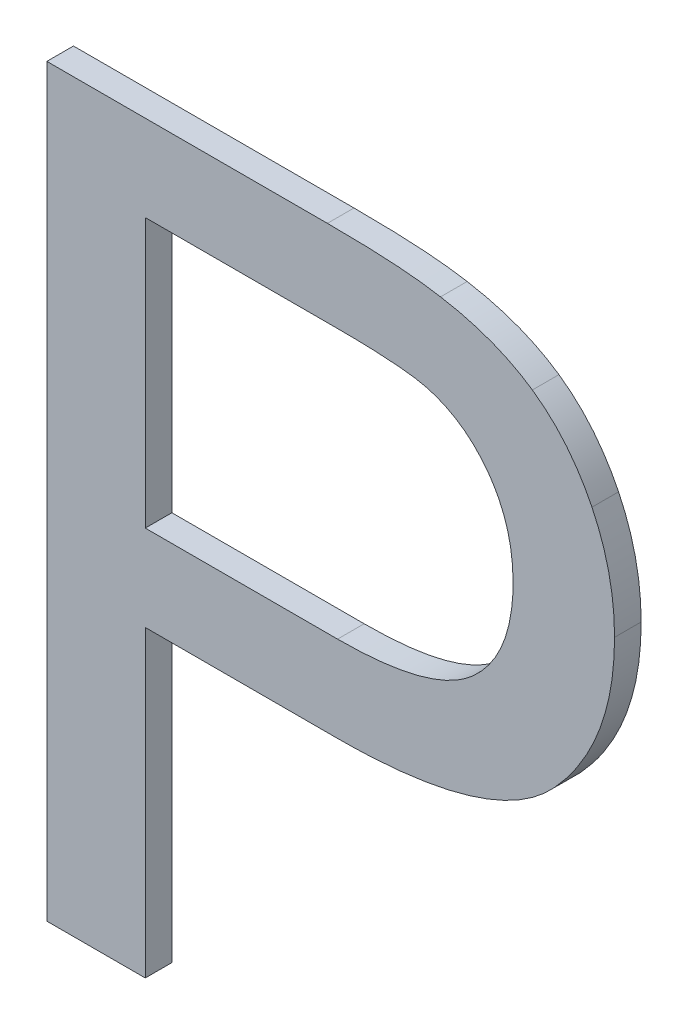
ISO-10303-21;
HEADER;
FILE_DESCRIPTION(('STEP AP214'),'2;1');
FILE_NAME('part.step','',(''),(''),'','','');
FILE_SCHEMA(('AUTOMOTIVE_DESIGN { 1 0 10303 214 1 1 1 1 }'));
ENDSEC;
DATA;
#1=APPLICATION_CONTEXT('core data for automotive mechanical design processes');
#2=APPLICATION_PROTOCOL_DEFINITION('international standard','automotive_design',2000,#1);
#3=PRODUCT_CONTEXT('',#1,'mechanical');
#4=PRODUCT('Part','Part','',(#3));
#5=PRODUCT_RELATED_PRODUCT_CATEGORY('part','',(#4));
#6=PRODUCT_DEFINITION_FORMATION('','',#4);
#7=PRODUCT_DEFINITION_CONTEXT('part definition',#1,'design');
#8=PRODUCT_DEFINITION('design','',#6,#7);
#9=PRODUCT_DEFINITION_SHAPE('','',#8);
#10=(LENGTH_UNIT() NAMED_UNIT(*) SI_UNIT(.MILLI.,.METRE.));
#11=(NAMED_UNIT(*) PLANE_ANGLE_UNIT() SI_UNIT($,.RADIAN.));
#12=(NAMED_UNIT(*) SI_UNIT($,.STERADIAN.) SOLID_ANGLE_UNIT());
#13=UNCERTAINTY_MEASURE_WITH_UNIT(LENGTH_MEASURE(1.E-05),#10,'distance_accuracy_value','');
#14=(GEOMETRIC_REPRESENTATION_CONTEXT(3) GLOBAL_UNCERTAINTY_ASSIGNED_CONTEXT((#13)) GLOBAL_UNIT_ASSIGNED_CONTEXT((#10,
#11,#12)) REPRESENTATION_CONTEXT('',''));
#15=CARTESIAN_POINT('',(0.,0.,0.));
#16=DIRECTION('',(0.,0.,1.));
#17=DIRECTION('',(1.,0.,0.));
#18=AXIS2_PLACEMENT_3D('',#15,#16,#17);
#19=CARTESIAN_POINT('',(3.01537266268,0.853362995687,0.05));
#20=DIRECTION('',(0.,0.,1.));
#21=DIRECTION('',(1.,0.,0.));
#22=AXIS2_PLACEMENT_3D('',#19,#20,#21);
#23=PLANE('',#22);
#24=DIRECTION('',(1.,0.,0.));
#25=VECTOR('',#24,1.);
#26=CARTESIAN_POINT('',(2.785882994186,0.732558139535,0.05));
#27=LINE('',#26,#25);
#28=CARTESIAN_POINT('',(2.785882994186,0.732558139535,0.05));
#29=VERTEX_POINT('',#28);
#30=CARTESIAN_POINT('',(3.147392805233,0.732558139535,0.05));
#31=VERTEX_POINT('',#30);
#32=EDGE_CURVE('E280',#29,#31,#27,.T.);
#33=ORIENTED_EDGE('',*,*,#32,.F.);
#34=DIRECTION('',(0.,-1.,0.));
#35=VECTOR('',#34,1.);
#36=CARTESIAN_POINT('',(2.785882994186,1.238226744186,0.05));
#37=LINE('',#36,#35);
#38=CARTESIAN_POINT('',(2.785882994186,1.238226744186,0.05));
#39=VERTEX_POINT('',#38);
#40=EDGE_CURVE('E393',#39,#29,#37,.T.);
#41=ORIENTED_EDGE('',*,*,#40,.F.);
#42=DIRECTION('',(-1.,0.,0.));
#43=VECTOR('',#42,1.);
#44=CARTESIAN_POINT('',(3.143577398256,1.238226744186,0.05));
#45=LINE('',#44,#43);
#46=CARTESIAN_POINT('',(3.143577398256,1.238226744186,0.05));
#47=VERTEX_POINT('',#46);
#48=EDGE_CURVE('E228',#47,#39,#45,.T.);
#49=ORIENTED_EDGE('',*,*,#48,.F.);
#50=CARTESIAN_POINT('',(3.316224563953,1.225699491279,0.05));
#51=CARTESIAN_POINT('',(3.269485828488,1.238226744186,0.05));
#52=CARTESIAN_POINT('',(3.143577398256,1.238226744186,0.05));
#53=(BOUNDED_CURVE() B_SPLINE_CURVE(2,(#50,#51,#52),.UNSPECIFIED.,.F.,
.F.) B_SPLINE_CURVE_WITH_KNOTS((3,3),(0.,1.),
.UNSPECIFIED.) CURVE() GEOMETRIC_REPRESENTATION_ITEM() RATIONAL_B_SPLINE_CURVE((1.,1.,1.)) REPRESENTATION_ITEM(''));
#54=CARTESIAN_POINT('',(3.316224563953,1.225699491279,0.05));
#55=VERTEX_POINT('',#54);
#56=EDGE_CURVE('E215',#55,#47,#53,.T.);
#57=ORIENTED_EDGE('',*,*,#56,.F.);
#58=CARTESIAN_POINT('',(3.433039607558,1.142205668605,0.05));
#59=CARTESIAN_POINT('',(3.388717296512,1.205414244186,0.05));
#60=CARTESIAN_POINT('',(3.316224563953,1.225699491279,0.05));
#61=(BOUNDED_CURVE() B_SPLINE_CURVE(2,(#58,#59,#60),.UNSPECIFIED.,.F.,
.F.) B_SPLINE_CURVE_WITH_KNOTS((3,3),(0.,1.),
.UNSPECIFIED.) CURVE() GEOMETRIC_REPRESENTATION_ITEM() RATIONAL_B_SPLINE_CURVE((1.,1.,1.)) REPRESENTATION_ITEM(''));
#62=CARTESIAN_POINT('',(3.433039607558,1.142205668605,0.05));
#63=VERTEX_POINT('',#62);
#64=EDGE_CURVE('E204',#63,#55,#61,.T.);
#65=ORIENTED_EDGE('',*,*,#64,.F.);
#66=CARTESIAN_POINT('',(3.477425508721,0.990225290698,0.05));
#67=CARTESIAN_POINT('',(3.477425508721,1.078997093023,0.05));
#68=CARTESIAN_POINT('',(3.433039607558,1.142205668605,0.05));
#69=(BOUNDED_CURVE() B_SPLINE_CURVE(2,(#66,#67,#68),.UNSPECIFIED.,.F.,
.F.) B_SPLINE_CURVE_WITH_KNOTS((3,3),(0.,1.),
.UNSPECIFIED.) CURVE() GEOMETRIC_REPRESENTATION_ITEM() RATIONAL_B_SPLINE_CURVE((1.,1.,1.)) REPRESENTATION_ITEM(''));
#70=CARTESIAN_POINT('',(3.477425508721,0.990225290698,0.05));
#71=VERTEX_POINT('',#70);
#72=EDGE_CURVE('E164',#71,#63,#69,.T.);
#73=ORIENTED_EDGE('',*,*,#72,.F.);
#74=CARTESIAN_POINT('',(3.40207122093,0.800090843023,0.05));
#75=CARTESIAN_POINT('',(3.477425508721,0.867687136628,0.05));
#76=CARTESIAN_POINT('',(3.477425508721,0.990225290698,0.05));
#77=(BOUNDED_CURVE() B_SPLINE_CURVE(2,(#74,#75,#76),.UNSPECIFIED.,.F.,
.F.) B_SPLINE_CURVE_WITH_KNOTS((3,3),(0.,1.),
.UNSPECIFIED.) CURVE() GEOMETRIC_REPRESENTATION_ITEM() RATIONAL_B_SPLINE_CURVE((1.,1.,1.)) REPRESENTATION_ITEM(''));
#78=CARTESIAN_POINT('',(3.40207122093,0.800090843023,0.05));
#79=VERTEX_POINT('',#78);
#80=EDGE_CURVE('E240',#79,#71,#77,.T.);
#81=ORIENTED_EDGE('',*,*,#80,.F.);
#82=CARTESIAN_POINT('',(3.147392805233,0.732558139535,0.05));
#83=CARTESIAN_POINT('',(3.32671693314,0.732558139535,0.05));
#84=CARTESIAN_POINT('',(3.40207122093,0.800090843023,0.05));
#85=(BOUNDED_CURVE() B_SPLINE_CURVE(2,(#82,#83,#84),.UNSPECIFIED.,.F.,
.F.) B_SPLINE_CURVE_WITH_KNOTS((3,3),(0.,1.),
.UNSPECIFIED.) CURVE() GEOMETRIC_REPRESENTATION_ITEM() RATIONAL_B_SPLINE_CURVE((1.,1.,1.)) REPRESENTATION_ITEM(''));
#86=EDGE_CURVE('E29',#31,#79,#85,.T.);
#87=ORIENTED_EDGE('',*,*,#86,.F.);
#88=EDGE_LOOP('',(#33,#41,#49,#57,#65,#73,#81,#87));
#89=FACE_BOUND('',#88,.T.);
#90=DIRECTION('',(0.,1.,0.));
#91=VECTOR('',#90,1.);
#92=CARTESIAN_POINT('',(2.600835755814,0.,0.05));
#93=LINE('',#92,#91);
#94=CARTESIAN_POINT('',(2.600835755814,0.,0.05));
#95=VERTEX_POINT('',#94);
#96=CARTESIAN_POINT('',(2.600835755814,1.4,0.05));
#97=VERTEX_POINT('',#96);
#98=EDGE_CURVE('E241',#95,#97,#93,.T.);
#99=ORIENTED_EDGE('',*,*,#98,.F.);
#100=DIRECTION('',(-1.,0.,0.));
#101=VECTOR('',#100,1.);
#102=CARTESIAN_POINT('',(2.785882994186,0.,0.05));
#103=LINE('',#102,#101);
#104=CARTESIAN_POINT('',(2.785882994186,0.,0.05));
#105=VERTEX_POINT('',#104);
#106=EDGE_CURVE('E271',#105,#95,#103,.T.);
#107=ORIENTED_EDGE('',*,*,#106,.F.);
#108=DIRECTION('',(0.,-1.,0.));
#109=VECTOR('',#108,1.);
#110=CARTESIAN_POINT('',(2.785882994186,0.570784883721,0.05));
#111=LINE('',#110,#109);
#112=CARTESIAN_POINT('',(2.785882994186,0.570784883721,0.05));
#113=VERTEX_POINT('',#112);
#114=EDGE_CURVE('E326',#113,#105,#111,.T.);
#115=ORIENTED_EDGE('',*,*,#114,.F.);
#116=DIRECTION('',(-1.,0.,0.));
#117=VECTOR('',#116,1.);
#118=CARTESIAN_POINT('',(3.14453125,0.570784883721,0.05));
#119=LINE('',#118,#117);
#120=CARTESIAN_POINT('',(3.14453125,0.570784883721,0.05));
#121=VERTEX_POINT('',#120);
#122=EDGE_CURVE('E254',#121,#113,#119,.T.);
#123=ORIENTED_EDGE('',*,*,#122,.F.);
#124=CARTESIAN_POINT('',(3.5546875,0.694213299419,0.05));
#125=CARTESIAN_POINT('',(3.441179142442,0.570784883721,0.05));
#126=CARTESIAN_POINT('',(3.14453125,0.570784883721,0.05));
#127=(BOUNDED_CURVE() B_SPLINE_CURVE(2,(#124,#125,#126),.UNSPECIFIED.,.F.,
.F.) B_SPLINE_CURVE_WITH_KNOTS((3,3),(0.,1.),
.UNSPECIFIED.) CURVE() GEOMETRIC_REPRESENTATION_ITEM() RATIONAL_B_SPLINE_CURVE((1.,1.,1.)) REPRESENTATION_ITEM(''));
#128=CARTESIAN_POINT('',(3.5546875,0.694213299419,0.05));
#129=VERTEX_POINT('',#128);
#130=EDGE_CURVE('E335',#129,#121,#127,.T.);
#131=ORIENTED_EDGE('',*,*,#130,.F.);
#132=CARTESIAN_POINT('',(3.668195857558,0.995884811047,0.05));
#133=CARTESIAN_POINT('',(3.668195857558,0.817641715116,0.05));
#134=CARTESIAN_POINT('',(3.5546875,0.694213299419,0.05));
#135=(BOUNDED_CURVE() B_SPLINE_CURVE(2,(#132,#133,#134),.UNSPECIFIED.,.F.,
.F.) B_SPLINE_CURVE_WITH_KNOTS((3,3),(0.,1.),
.UNSPECIFIED.) CURVE() GEOMETRIC_REPRESENTATION_ITEM() RATIONAL_B_SPLINE_CURVE((1.,1.,1.)) REPRESENTATION_ITEM(''));
#136=CARTESIAN_POINT('',(3.668195857558,0.995884811047,0.05));
#137=VERTEX_POINT('',#136);
#138=EDGE_CURVE('E287',#137,#129,#135,.T.);
#139=ORIENTED_EDGE('',*,*,#138,.F.);
#140=CARTESIAN_POINT('',(3.625717659884,1.186527979651,0.05));
#141=CARTESIAN_POINT('',(3.668195857558,1.099791061047,0.05));
#142=CARTESIAN_POINT('',(3.668195857558,0.995884811047,0.05));
#143=(BOUNDED_CURVE() B_SPLINE_CURVE(2,(#140,#141,#142),.UNSPECIFIED.,.F.,
.F.) B_SPLINE_CURVE_WITH_KNOTS((3,3),(0.,1.),
.UNSPECIFIED.) CURVE() GEOMETRIC_REPRESENTATION_ITEM() RATIONAL_B_SPLINE_CURVE((1.,1.,1.)) REPRESENTATION_ITEM(''));
#144=CARTESIAN_POINT('',(3.625717659884,1.186527979651,0.05));
#145=VERTEX_POINT('',#144);
#146=EDGE_CURVE('E269',#145,#137,#143,.T.);
#147=ORIENTED_EDGE('',*,*,#146,.F.);
#148=CARTESIAN_POINT('',(3.513671875,1.321339026163,0.05));
#149=CARTESIAN_POINT('',(3.583303052326,1.273264898256,0.05));
#150=CARTESIAN_POINT('',(3.625717659884,1.186527979651,0.05));
#151=(BOUNDED_CURVE() B_SPLINE_CURVE(2,(#148,#149,#150),.UNSPECIFIED.,.F.,
.F.) B_SPLINE_CURVE_WITH_KNOTS((3,3),(0.,1.),
.UNSPECIFIED.) CURVE() GEOMETRIC_REPRESENTATION_ITEM() RATIONAL_B_SPLINE_CURVE((1.,1.,1.)) REPRESENTATION_ITEM(''));
#152=CARTESIAN_POINT('',(3.513671875,1.321339026163,0.05));
#153=VERTEX_POINT('',#152);
#154=EDGE_CURVE('E300',#153,#145,#151,.T.);
#155=ORIENTED_EDGE('',*,*,#154,.F.);
#156=CARTESIAN_POINT('',(3.341024709302,1.386646075581,0.05));
#157=CARTESIAN_POINT('',(3.444040697674,1.369476744186,0.05));
#158=CARTESIAN_POINT('',(3.513671875,1.321339026163,0.05));
#159=(BOUNDED_CURVE() B_SPLINE_CURVE(2,(#156,#157,#158),.UNSPECIFIED.,.F.,
.F.) B_SPLINE_CURVE_WITH_KNOTS((3,3),(0.,1.),
.UNSPECIFIED.) CURVE() GEOMETRIC_REPRESENTATION_ITEM() RATIONAL_B_SPLINE_CURVE((1.,1.,1.)) REPRESENTATION_ITEM(''));
#160=CARTESIAN_POINT('',(3.341024709302,1.386646075581,0.05));
#161=VERTEX_POINT('',#160);
#162=EDGE_CURVE('E308',#161,#153,#159,.T.);
#163=ORIENTED_EDGE('',*,*,#162,.F.);
#164=CARTESIAN_POINT('',(3.128315770349,1.4,0.05));
#165=CARTESIAN_POINT('',(3.267578125,1.4,0.05));
#166=CARTESIAN_POINT('',(3.341024709302,1.386646075581,0.05));
#167=(BOUNDED_CURVE() B_SPLINE_CURVE(2,(#164,#165,#166),.UNSPECIFIED.,.F.,
.F.) B_SPLINE_CURVE_WITH_KNOTS((3,3),(0.,1.),
.UNSPECIFIED.) CURVE() GEOMETRIC_REPRESENTATION_ITEM() RATIONAL_B_SPLINE_CURVE((1.,1.,1.)) REPRESENTATION_ITEM(''));
#168=CARTESIAN_POINT('',(3.128315770349,1.4,0.05));
#169=VERTEX_POINT('',#168);
#170=EDGE_CURVE('E369',#169,#161,#167,.T.);
#171=ORIENTED_EDGE('',*,*,#170,.F.);
#172=DIRECTION('',(1.,0.,0.));
#173=VECTOR('',#172,1.);
#174=CARTESIAN_POINT('',(2.600835755814,1.4,0.05));
#175=LINE('',#174,#173);
#176=EDGE_CURVE('E233',#97,#169,#175,.T.);
#177=ORIENTED_EDGE('',*,*,#176,.F.);
#178=EDGE_LOOP('',(#99,#107,#115,#123,#131,#139,#147,#155,#163,#171,#177));
#179=FACE_BOUND('',#178,.T.);
#180=ADVANCED_FACE('F17',(#89,#179),#23,.T.);
#181=CARTESIAN_POINT('',(3.01537266268,0.853362995687,0.));
#182=DIRECTION('',(0.,0.,1.));
#183=DIRECTION('',(1.,0.,0.));
#184=AXIS2_PLACEMENT_3D('',#181,#182,#183);
#185=PLANE('',#184);
#186=CARTESIAN_POINT('',(3.147392805233,0.732558139535,0.));
#187=CARTESIAN_POINT('',(3.32671693314,0.732558139535,0.));
#188=CARTESIAN_POINT('',(3.40207122093,0.800090843023,0.));
#189=(BOUNDED_CURVE() B_SPLINE_CURVE(2,(#186,#187,#188),.UNSPECIFIED.,.F.,
.F.) B_SPLINE_CURVE_WITH_KNOTS((3,3),(0.,1.),
.UNSPECIFIED.) CURVE() GEOMETRIC_REPRESENTATION_ITEM() RATIONAL_B_SPLINE_CURVE((1.,1.,1.)) REPRESENTATION_ITEM(''));
#190=CARTESIAN_POINT('',(3.147392805233,0.732558139535,0.));
#191=VERTEX_POINT('',#190);
#192=CARTESIAN_POINT('',(3.40207122093,0.800090843023,0.));
#193=VERTEX_POINT('',#192);
#194=EDGE_CURVE('E11',#191,#193,#189,.T.);
#195=ORIENTED_EDGE('',*,*,#194,.T.);
#196=CARTESIAN_POINT('',(3.40207122093,0.800090843023,0.));
#197=CARTESIAN_POINT('',(3.477425508721,0.867687136628,0.));
#198=CARTESIAN_POINT('',(3.477425508721,0.990225290698,0.));
#199=(BOUNDED_CURVE() B_SPLINE_CURVE(2,(#196,#197,#198),.UNSPECIFIED.,.F.,
.F.) B_SPLINE_CURVE_WITH_KNOTS((3,3),(0.,1.),
.UNSPECIFIED.) CURVE() GEOMETRIC_REPRESENTATION_ITEM() RATIONAL_B_SPLINE_CURVE((1.,1.,1.)) REPRESENTATION_ITEM(''));
#200=CARTESIAN_POINT('',(3.477425508721,0.990225290698,0.));
#201=VERTEX_POINT('',#200);
#202=EDGE_CURVE('E261',#193,#201,#199,.T.);
#203=ORIENTED_EDGE('',*,*,#202,.T.);
#204=CARTESIAN_POINT('',(3.477425508721,0.990225290698,0.));
#205=CARTESIAN_POINT('',(3.477425508721,1.078997093023,0.));
#206=CARTESIAN_POINT('',(3.433039607558,1.142205668605,0.));
#207=(BOUNDED_CURVE() B_SPLINE_CURVE(2,(#204,#205,#206),.UNSPECIFIED.,.F.,
.F.) B_SPLINE_CURVE_WITH_KNOTS((3,3),(0.,1.),
.UNSPECIFIED.) CURVE() GEOMETRIC_REPRESENTATION_ITEM() RATIONAL_B_SPLINE_CURVE((1.,1.,1.)) REPRESENTATION_ITEM(''));
#208=CARTESIAN_POINT('',(3.433039607558,1.142205668605,0.));
#209=VERTEX_POINT('',#208);
#210=EDGE_CURVE('E175',#201,#209,#207,.T.);
#211=ORIENTED_EDGE('',*,*,#210,.T.);
#212=CARTESIAN_POINT('',(3.433039607558,1.142205668605,0.));
#213=CARTESIAN_POINT('',(3.388717296512,1.205414244186,0.));
#214=CARTESIAN_POINT('',(3.316224563953,1.225699491279,0.));
#215=(BOUNDED_CURVE() B_SPLINE_CURVE(2,(#212,#213,#214),.UNSPECIFIED.,.F.,
.F.) B_SPLINE_CURVE_WITH_KNOTS((3,3),(0.,1.),
.UNSPECIFIED.) CURVE() GEOMETRIC_REPRESENTATION_ITEM() RATIONAL_B_SPLINE_CURVE((1.,1.,1.)) REPRESENTATION_ITEM(''));
#216=CARTESIAN_POINT('',(3.316224563953,1.225699491279,0.));
#217=VERTEX_POINT('',#216);
#218=EDGE_CURVE('E193',#209,#217,#215,.T.);
#219=ORIENTED_EDGE('',*,*,#218,.T.);
#220=CARTESIAN_POINT('',(3.316224563953,1.225699491279,0.));
#221=CARTESIAN_POINT('',(3.269485828488,1.238226744186,0.));
#222=CARTESIAN_POINT('',(3.143577398256,1.238226744186,0.));
#223=(BOUNDED_CURVE() B_SPLINE_CURVE(2,(#220,#221,#222),.UNSPECIFIED.,.F.,
.F.) B_SPLINE_CURVE_WITH_KNOTS((3,3),(0.,1.),
.UNSPECIFIED.) CURVE() GEOMETRIC_REPRESENTATION_ITEM() RATIONAL_B_SPLINE_CURVE((1.,1.,1.)) REPRESENTATION_ITEM(''));
#224=CARTESIAN_POINT('',(3.143577398256,1.238226744186,0.));
#225=VERTEX_POINT('',#224);
#226=EDGE_CURVE('E197',#217,#225,#223,.T.);
#227=ORIENTED_EDGE('',*,*,#226,.T.);
#228=DIRECTION('',(-1.,0.,0.));
#229=VECTOR('',#228,1.);
#230=CARTESIAN_POINT('',(3.143577398256,1.238226744186,0.));
#231=LINE('',#230,#229);
#232=CARTESIAN_POINT('',(2.785882994186,1.238226744186,0.));
#233=VERTEX_POINT('',#232);
#234=EDGE_CURVE('E220',#225,#233,#231,.T.);
#235=ORIENTED_EDGE('',*,*,#234,.T.);
#236=DIRECTION('',(0.,-1.,0.));
#237=VECTOR('',#236,1.);
#238=CARTESIAN_POINT('',(2.785882994186,1.238226744186,0.));
#239=LINE('',#238,#237);
#240=CARTESIAN_POINT('',(2.785882994186,0.732558139535,0.));
#241=VERTEX_POINT('',#240);
#242=EDGE_CURVE('E353',#233,#241,#239,.T.);
#243=ORIENTED_EDGE('',*,*,#242,.T.);
#244=DIRECTION('',(1.,0.,0.));
#245=VECTOR('',#244,1.);
#246=CARTESIAN_POINT('',(2.785882994186,0.732558139535,0.));
#247=LINE('',#246,#245);
#248=EDGE_CURVE('E279',#241,#191,#247,.T.);
#249=ORIENTED_EDGE('',*,*,#248,.T.);
#250=EDGE_LOOP('',(#195,#203,#211,#219,#227,#235,#243,#249));
#251=FACE_BOUND('',#250,.T.);
#252=DIRECTION('',(1.,0.,0.));
#253=VECTOR('',#252,1.);
#254=CARTESIAN_POINT('',(2.600835755814,1.4,0.));
#255=LINE('',#254,#253);
#256=CARTESIAN_POINT('',(2.600835755814,1.4,0.));
#257=VERTEX_POINT('',#256);
#258=CARTESIAN_POINT('',(3.128315770349,1.4,0.));
#259=VERTEX_POINT('',#258);
#260=EDGE_CURVE('E22',#257,#259,#255,.T.);
#261=ORIENTED_EDGE('',*,*,#260,.T.);
#262=CARTESIAN_POINT('',(3.128315770349,1.4,0.));
#263=CARTESIAN_POINT('',(3.267578125,1.4,0.));
#264=CARTESIAN_POINT('',(3.341024709302,1.386646075581,0.));
#265=(BOUNDED_CURVE() B_SPLINE_CURVE(2,(#262,#263,#264),.UNSPECIFIED.,.F.,
.F.) B_SPLINE_CURVE_WITH_KNOTS((3,3),(0.,1.),
.UNSPECIFIED.) CURVE() GEOMETRIC_REPRESENTATION_ITEM() RATIONAL_B_SPLINE_CURVE((1.,1.,1.)) REPRESENTATION_ITEM(''));
#266=CARTESIAN_POINT('',(3.341024709302,1.386646075581,0.));
#267=VERTEX_POINT('',#266);
#268=EDGE_CURVE('E235',#259,#267,#265,.T.);
#269=ORIENTED_EDGE('',*,*,#268,.T.);
#270=CARTESIAN_POINT('',(3.341024709302,1.386646075581,0.));
#271=CARTESIAN_POINT('',(3.444040697674,1.369476744186,0.));
#272=CARTESIAN_POINT('',(3.513671875,1.321339026163,0.));
#273=(BOUNDED_CURVE() B_SPLINE_CURVE(2,(#270,#271,#272),.UNSPECIFIED.,.F.,
.F.) B_SPLINE_CURVE_WITH_KNOTS((3,3),(0.,1.),
.UNSPECIFIED.) CURVE() GEOMETRIC_REPRESENTATION_ITEM() RATIONAL_B_SPLINE_CURVE((1.,1.,1.)) REPRESENTATION_ITEM(''));
#274=CARTESIAN_POINT('',(3.513671875,1.321339026163,0.));
#275=VERTEX_POINT('',#274);
#276=EDGE_CURVE('E302',#267,#275,#273,.T.);
#277=ORIENTED_EDGE('',*,*,#276,.T.);
#278=CARTESIAN_POINT('',(3.513671875,1.321339026163,0.));
#279=CARTESIAN_POINT('',(3.583303052326,1.273264898256,0.));
#280=CARTESIAN_POINT('',(3.625717659884,1.186527979651,0.));
#281=(BOUNDED_CURVE() B_SPLINE_CURVE(2,(#278,#279,#280),.UNSPECIFIED.,.F.,
.F.) B_SPLINE_CURVE_WITH_KNOTS((3,3),(0.,1.),
.UNSPECIFIED.) CURVE() GEOMETRIC_REPRESENTATION_ITEM() RATIONAL_B_SPLINE_CURVE((1.,1.,1.)) REPRESENTATION_ITEM(''));
#282=CARTESIAN_POINT('',(3.625717659884,1.186527979651,0.));
#283=VERTEX_POINT('',#282);
#284=EDGE_CURVE('E329',#275,#283,#281,.T.);
#285=ORIENTED_EDGE('',*,*,#284,.T.);
#286=CARTESIAN_POINT('',(3.625717659884,1.186527979651,0.));
#287=CARTESIAN_POINT('',(3.668195857558,1.099791061047,0.));
#288=CARTESIAN_POINT('',(3.668195857558,0.995884811047,0.));
#289=(BOUNDED_CURVE() B_SPLINE_CURVE(2,(#286,#287,#288),.UNSPECIFIED.,.F.,
.F.) B_SPLINE_CURVE_WITH_KNOTS((3,3),(0.,1.),
.UNSPECIFIED.) CURVE() GEOMETRIC_REPRESENTATION_ITEM() RATIONAL_B_SPLINE_CURVE((1.,1.,1.)) REPRESENTATION_ITEM(''));
#290=CARTESIAN_POINT('',(3.668195857558,0.995884811047,0.));
#291=VERTEX_POINT('',#290);
#292=EDGE_CURVE('E301',#283,#291,#289,.T.);
#293=ORIENTED_EDGE('',*,*,#292,.T.);
#294=CARTESIAN_POINT('',(3.668195857558,0.995884811047,0.));
#295=CARTESIAN_POINT('',(3.668195857558,0.817641715116,0.));
#296=CARTESIAN_POINT('',(3.5546875,0.694213299419,0.));
#297=(BOUNDED_CURVE() B_SPLINE_CURVE(2,(#294,#295,#296),.UNSPECIFIED.,.F.,
.F.) B_SPLINE_CURVE_WITH_KNOTS((3,3),(0.,1.),
.UNSPECIFIED.) CURVE() GEOMETRIC_REPRESENTATION_ITEM() RATIONAL_B_SPLINE_CURVE((1.,1.,1.)) REPRESENTATION_ITEM(''));
#298=CARTESIAN_POINT('',(3.5546875,0.694213299419,0.));
#299=VERTEX_POINT('',#298);
#300=EDGE_CURVE('E270',#291,#299,#297,.T.);
#301=ORIENTED_EDGE('',*,*,#300,.T.);
#302=CARTESIAN_POINT('',(3.5546875,0.694213299419,0.));
#303=CARTESIAN_POINT('',(3.441179142442,0.570784883721,0.));
#304=CARTESIAN_POINT('',(3.14453125,0.570784883721,0.));
#305=(BOUNDED_CURVE() B_SPLINE_CURVE(2,(#302,#303,#304),.UNSPECIFIED.,.F.,
.F.) B_SPLINE_CURVE_WITH_KNOTS((3,3),(0.,1.),
.UNSPECIFIED.) CURVE() GEOMETRIC_REPRESENTATION_ITEM() RATIONAL_B_SPLINE_CURVE((1.,1.,1.)) REPRESENTATION_ITEM(''));
#306=CARTESIAN_POINT('',(3.14453125,0.570784883721,0.));
#307=VERTEX_POINT('',#306);
#308=EDGE_CURVE('E343',#299,#307,#305,.T.);
#309=ORIENTED_EDGE('',*,*,#308,.T.);
#310=DIRECTION('',(-1.,0.,0.));
#311=VECTOR('',#310,1.);
#312=CARTESIAN_POINT('',(3.14453125,0.570784883721,0.));
#313=LINE('',#312,#311);
#314=CARTESIAN_POINT('',(2.785882994186,0.570784883721,0.));
#315=VERTEX_POINT('',#314);
#316=EDGE_CURVE('E286',#307,#315,#313,.T.);
#317=ORIENTED_EDGE('',*,*,#316,.T.);
#318=DIRECTION('',(0.,-1.,0.));
#319=VECTOR('',#318,1.);
#320=CARTESIAN_POINT('',(2.785882994186,0.570784883721,0.));
#321=LINE('',#320,#319);
#322=CARTESIAN_POINT('',(2.785882994186,0.,0.));
#323=VERTEX_POINT('',#322);
#324=EDGE_CURVE('E255',#315,#323,#321,.T.);
#325=ORIENTED_EDGE('',*,*,#324,.T.);
#326=DIRECTION('',(-1.,0.,0.));
#327=VECTOR('',#326,1.);
#328=CARTESIAN_POINT('',(2.785882994186,0.,0.));
#329=LINE('',#328,#327);
#330=CARTESIAN_POINT('',(2.600835755814,0.,0.));
#331=VERTEX_POINT('',#330);
#332=EDGE_CURVE('E274',#323,#331,#329,.T.);
#333=ORIENTED_EDGE('',*,*,#332,.T.);
#334=DIRECTION('',(0.,1.,0.));
#335=VECTOR('',#334,1.);
#336=CARTESIAN_POINT('',(2.600835755814,0.,0.));
#337=LINE('',#336,#335);
#338=EDGE_CURVE('E411',#331,#257,#337,.T.);
#339=ORIENTED_EDGE('',*,*,#338,.T.);
#340=EDGE_LOOP('',(#261,#269,#277,#285,#293,#301,#309,#317,#325,#333,#339));
#341=FACE_BOUND('',#340,.T.);
#342=ADVANCED_FACE('F195',(#251,#341),#185,.F.);
#343=CARTESIAN_POINT('',(3.147392805233,0.732558139535,0.));
#344=CARTESIAN_POINT('',(3.32671693314,0.732558139535,0.));
#345=CARTESIAN_POINT('',(3.40207122093,0.800090843023,0.));
#346=(BOUNDED_CURVE() B_SPLINE_CURVE(2,(#343,#344,#345),.UNSPECIFIED.,.F.,
.F.) B_SPLINE_CURVE_WITH_KNOTS((3,3),(0.,1.),
.UNSPECIFIED.) CURVE() GEOMETRIC_REPRESENTATION_ITEM() RATIONAL_B_SPLINE_CURVE((1.,1.,1.)) REPRESENTATION_ITEM(''));
#347=DIRECTION('',(0.,0.,-1.));
#348=VECTOR('',#347,1.);
#349=SURFACE_OF_LINEAR_EXTRUSION('',#346,#348);
#350=DIRECTION('',(0.,0.,1.));
#351=VECTOR('',#350,1.);
#352=CARTESIAN_POINT('',(3.147392805233,0.732558139535,0.));
#353=LINE('',#352,#351);
#354=EDGE_CURVE('E276',#191,#31,#353,.T.);
#355=ORIENTED_EDGE('',*,*,#354,.T.);
#356=ORIENTED_EDGE('',*,*,#86,.T.);
#357=DIRECTION('',(0.,0.,1.));
#358=VECTOR('',#357,1.);
#359=CARTESIAN_POINT('',(3.40207122093,0.800090843023,0.));
#360=LINE('',#359,#358);
#361=EDGE_CURVE('E236',#193,#79,#360,.T.);
#362=ORIENTED_EDGE('',*,*,#361,.F.);
#363=ORIENTED_EDGE('',*,*,#194,.F.);
#364=EDGE_LOOP('',(#355,#356,#362,#363));
#365=FACE_BOUND('',#364,.T.);
#366=ADVANCED_FACE('F593',(#365),#349,.T.);
#367=CARTESIAN_POINT('',(3.40207122093,0.800090843023,0.));
#368=CARTESIAN_POINT('',(3.477425508721,0.867687136628,0.));
#369=CARTESIAN_POINT('',(3.477425508721,0.990225290698,0.));
#370=(BOUNDED_CURVE() B_SPLINE_CURVE(2,(#367,#368,#369),.UNSPECIFIED.,.F.,
.F.) B_SPLINE_CURVE_WITH_KNOTS((3,3),(0.,1.),
.UNSPECIFIED.) CURVE() GEOMETRIC_REPRESENTATION_ITEM() RATIONAL_B_SPLINE_CURVE((1.,1.,1.)) REPRESENTATION_ITEM(''));
#371=DIRECTION('',(0.,0.,-1.));
#372=VECTOR('',#371,1.);
#373=SURFACE_OF_LINEAR_EXTRUSION('',#370,#372);
#374=ORIENTED_EDGE('',*,*,#361,.T.);
#375=ORIENTED_EDGE('',*,*,#80,.T.);
#376=DIRECTION('',(0.,0.,1.));
#377=VECTOR('',#376,1.);
#378=CARTESIAN_POINT('',(3.477425508721,0.990225290698,0.));
#379=LINE('',#378,#377);
#380=EDGE_CURVE('E203',#201,#71,#379,.T.);
#381=ORIENTED_EDGE('',*,*,#380,.F.);
#382=ORIENTED_EDGE('',*,*,#202,.F.);
#383=EDGE_LOOP('',(#374,#375,#381,#382));
#384=FACE_BOUND('',#383,.T.);
#385=ADVANCED_FACE('F19',(#384),#373,.T.);
#386=CARTESIAN_POINT('',(3.477425508721,0.990225290698,0.));
#387=CARTESIAN_POINT('',(3.477425508721,1.078997093023,0.));
#388=CARTESIAN_POINT('',(3.433039607558,1.142205668605,0.));
#389=(BOUNDED_CURVE() B_SPLINE_CURVE(2,(#386,#387,#388),.UNSPECIFIED.,.F.,
.F.) B_SPLINE_CURVE_WITH_KNOTS((3,3),(0.,1.),
.UNSPECIFIED.) CURVE() GEOMETRIC_REPRESENTATION_ITEM() RATIONAL_B_SPLINE_CURVE((1.,1.,1.)) REPRESENTATION_ITEM(''));
#390=DIRECTION('',(0.,0.,-1.));
#391=VECTOR('',#390,1.);
#392=SURFACE_OF_LINEAR_EXTRUSION('',#389,#391);
#393=ORIENTED_EDGE('',*,*,#380,.T.);
#394=ORIENTED_EDGE('',*,*,#72,.T.);
#395=DIRECTION('',(0.,0.,1.));
#396=VECTOR('',#395,1.);
#397=CARTESIAN_POINT('',(3.433039607558,1.142205668605,0.));
#398=LINE('',#397,#396);
#399=EDGE_CURVE('E214',#209,#63,#398,.T.);
#400=ORIENTED_EDGE('',*,*,#399,.F.);
#401=ORIENTED_EDGE('',*,*,#210,.F.);
#402=EDGE_LOOP('',(#393,#394,#400,#401));
#403=FACE_BOUND('',#402,.T.);
#404=ADVANCED_FACE('F606',(#403),#392,.T.);
#405=CARTESIAN_POINT('',(3.433039607558,1.142205668605,0.));
#406=CARTESIAN_POINT('',(3.388717296512,1.205414244186,0.));
#407=CARTESIAN_POINT('',(3.316224563953,1.225699491279,0.));
#408=(BOUNDED_CURVE() B_SPLINE_CURVE(2,(#405,#406,#407),.UNSPECIFIED.,.F.,
.F.) B_SPLINE_CURVE_WITH_KNOTS((3,3),(0.,1.),
.UNSPECIFIED.) CURVE() GEOMETRIC_REPRESENTATION_ITEM() RATIONAL_B_SPLINE_CURVE((1.,1.,1.)) REPRESENTATION_ITEM(''));
#409=DIRECTION('',(0.,0.,-1.));
#410=VECTOR('',#409,1.);
#411=SURFACE_OF_LINEAR_EXTRUSION('',#408,#410);
#412=ORIENTED_EDGE('',*,*,#399,.T.);
#413=ORIENTED_EDGE('',*,*,#64,.T.);
#414=DIRECTION('',(0.,0.,1.));
#415=VECTOR('',#414,1.);
#416=CARTESIAN_POINT('',(3.316224563953,1.225699491279,0.));
#417=LINE('',#416,#415);
#418=EDGE_CURVE('E210',#217,#55,#417,.T.);
#419=ORIENTED_EDGE('',*,*,#418,.F.);
#420=ORIENTED_EDGE('',*,*,#218,.F.);
#421=EDGE_LOOP('',(#412,#413,#419,#420));
#422=FACE_BOUND('',#421,.T.);
#423=ADVANCED_FACE('F217',(#422),#411,.T.);
#424=CARTESIAN_POINT('',(3.316224563953,1.225699491279,0.));
#425=CARTESIAN_POINT('',(3.269485828488,1.238226744186,0.));
#426=CARTESIAN_POINT('',(3.143577398256,1.238226744186,0.));
#427=(BOUNDED_CURVE() B_SPLINE_CURVE(2,(#424,#425,#426),.UNSPECIFIED.,.F.,
.F.) B_SPLINE_CURVE_WITH_KNOTS((3,3),(0.,1.),
.UNSPECIFIED.) CURVE() GEOMETRIC_REPRESENTATION_ITEM() RATIONAL_B_SPLINE_CURVE((1.,1.,1.)) REPRESENTATION_ITEM(''));
#428=DIRECTION('',(0.,0.,-1.));
#429=VECTOR('',#428,1.);
#430=SURFACE_OF_LINEAR_EXTRUSION('',#427,#429);
#431=ORIENTED_EDGE('',*,*,#418,.T.);
#432=ORIENTED_EDGE('',*,*,#56,.T.);
#433=DIRECTION('',(0.,0.,1.));
#434=VECTOR('',#433,1.);
#435=CARTESIAN_POINT('',(3.143577398256,1.238226744186,0.));
#436=LINE('',#435,#434);
#437=EDGE_CURVE('E212',#225,#47,#436,.T.);
#438=ORIENTED_EDGE('',*,*,#437,.F.);
#439=ORIENTED_EDGE('',*,*,#226,.F.);
#440=EDGE_LOOP('',(#431,#432,#438,#439));
#441=FACE_BOUND('',#440,.T.);
#442=ADVANCED_FACE('F209',(#441),#430,.T.);
#443=CARTESIAN_POINT('',(3.143577398256,1.238226744186,0.));
#444=DIRECTION('',(0.,-1.,0.));
#445=DIRECTION('',(0.,0.,-1.));
#446=AXIS2_PLACEMENT_3D('',#443,#444,#445);
#447=PLANE('',#446);
#448=ORIENTED_EDGE('',*,*,#437,.T.);
#449=ORIENTED_EDGE('',*,*,#48,.T.);
#450=DIRECTION('',(0.,0.,1.));
#451=VECTOR('',#450,1.);
#452=CARTESIAN_POINT('',(2.785882994186,1.238226744186,0.));
#453=LINE('',#452,#451);
#454=EDGE_CURVE('E231',#233,#39,#453,.T.);
#455=ORIENTED_EDGE('',*,*,#454,.F.);
#456=ORIENTED_EDGE('',*,*,#234,.F.);
#457=EDGE_LOOP('',(#448,#449,#455,#456));
#458=FACE_BOUND('',#457,.T.);
#459=ADVANCED_FACE('F566',(#458),#447,.T.);
#460=CARTESIAN_POINT('',(2.785882994186,1.238226744186,0.));
#461=DIRECTION('',(1.,0.,0.));
#462=DIRECTION('',(0.,1.,0.));
#463=AXIS2_PLACEMENT_3D('',#460,#461,#462);
#464=PLANE('',#463);
#465=ORIENTED_EDGE('',*,*,#454,.T.);
#466=ORIENTED_EDGE('',*,*,#40,.T.);
#467=DIRECTION('',(0.,0.,1.));
#468=VECTOR('',#467,1.);
#469=CARTESIAN_POINT('',(2.785882994186,0.732558139535,0.));
#470=LINE('',#469,#468);
#471=EDGE_CURVE('E309',#241,#29,#470,.T.);
#472=ORIENTED_EDGE('',*,*,#471,.F.);
#473=ORIENTED_EDGE('',*,*,#242,.F.);
#474=EDGE_LOOP('',(#465,#466,#472,#473));
#475=FACE_BOUND('',#474,.T.);
#476=ADVANCED_FACE('F562',(#475),#464,.T.);
#477=CARTESIAN_POINT('',(2.785882994186,0.732558139535,0.));
#478=DIRECTION('',(0.,1.,0.));
#479=DIRECTION('',(1.,0.,0.));
#480=AXIS2_PLACEMENT_3D('',#477,#478,#479);
#481=PLANE('',#480);
#482=ORIENTED_EDGE('',*,*,#471,.T.);
#483=ORIENTED_EDGE('',*,*,#32,.T.);
#484=ORIENTED_EDGE('',*,*,#354,.F.);
#485=ORIENTED_EDGE('',*,*,#248,.F.);
#486=EDGE_LOOP('',(#482,#483,#484,#485));
#487=FACE_BOUND('',#486,.T.);
#488=ADVANCED_FACE('F565',(#487),#481,.T.);
#489=CARTESIAN_POINT('',(2.600835755814,1.4,0.));
#490=DIRECTION('',(0.,1.,0.));
#491=DIRECTION('',(1.,0.,0.));
#492=AXIS2_PLACEMENT_3D('',#489,#490,#491);
#493=PLANE('',#492);
#494=DIRECTION('',(0.,0.,1.));
#495=VECTOR('',#494,1.);
#496=CARTESIAN_POINT('',(2.600835755814,1.4,0.));
#497=LINE('',#496,#495);
#498=EDGE_CURVE('E245',#257,#97,#497,.T.);
#499=ORIENTED_EDGE('',*,*,#498,.T.);
#500=ORIENTED_EDGE('',*,*,#176,.T.);
#501=DIRECTION('',(0.,0.,1.));
#502=VECTOR('',#501,1.);
#503=CARTESIAN_POINT('',(3.128315770349,1.4,0.));
#504=LINE('',#503,#502);
#505=EDGE_CURVE('E307',#259,#169,#504,.T.);
#506=ORIENTED_EDGE('',*,*,#505,.F.);
#507=ORIENTED_EDGE('',*,*,#260,.F.);
#508=EDGE_LOOP('',(#499,#500,#506,#507));
#509=FACE_BOUND('',#508,.T.);
#510=ADVANCED_FACE('F696',(#509),#493,.T.);
#511=CARTESIAN_POINT('',(3.128315770349,1.4,0.));
#512=CARTESIAN_POINT('',(3.267578125,1.4,0.));
#513=CARTESIAN_POINT('',(3.341024709302,1.386646075581,0.));
#514=(BOUNDED_CURVE() B_SPLINE_CURVE(2,(#511,#512,#513),.UNSPECIFIED.,.F.,
.F.) B_SPLINE_CURVE_WITH_KNOTS((3,3),(0.,1.),
.UNSPECIFIED.) CURVE() GEOMETRIC_REPRESENTATION_ITEM() RATIONAL_B_SPLINE_CURVE((1.,1.,1.)) REPRESENTATION_ITEM(''));
#515=DIRECTION('',(0.,0.,-1.));
#516=VECTOR('',#515,1.);
#517=SURFACE_OF_LINEAR_EXTRUSION('',#514,#516);
#518=ORIENTED_EDGE('',*,*,#505,.T.);
#519=ORIENTED_EDGE('',*,*,#170,.T.);
#520=DIRECTION('',(0.,0.,1.));
#521=VECTOR('',#520,1.);
#522=CARTESIAN_POINT('',(3.341024709302,1.386646075581,0.));
#523=LINE('',#522,#521);
#524=EDGE_CURVE('E334',#267,#161,#523,.T.);
#525=ORIENTED_EDGE('',*,*,#524,.F.);
#526=ORIENTED_EDGE('',*,*,#268,.F.);
#527=EDGE_LOOP('',(#518,#519,#525,#526));
#528=FACE_BOUND('',#527,.T.);
#529=ADVANCED_FACE('F554',(#528),#517,.T.);
#530=CARTESIAN_POINT('',(3.341024709302,1.386646075581,0.));
#531=CARTESIAN_POINT('',(3.444040697674,1.369476744186,0.));
#532=CARTESIAN_POINT('',(3.513671875,1.321339026163,0.));
#533=(BOUNDED_CURVE() B_SPLINE_CURVE(2,(#530,#531,#532),.UNSPECIFIED.,.F.,
.F.) B_SPLINE_CURVE_WITH_KNOTS((3,3),(0.,1.),
.UNSPECIFIED.) CURVE() GEOMETRIC_REPRESENTATION_ITEM() RATIONAL_B_SPLINE_CURVE((1.,1.,1.)) REPRESENTATION_ITEM(''));
#534=DIRECTION('',(0.,0.,-1.));
#535=VECTOR('',#534,1.);
#536=SURFACE_OF_LINEAR_EXTRUSION('',#533,#535);
#537=ORIENTED_EDGE('',*,*,#524,.T.);
#538=ORIENTED_EDGE('',*,*,#162,.T.);
#539=DIRECTION('',(0.,0.,1.));
#540=VECTOR('',#539,1.);
#541=CARTESIAN_POINT('',(3.513671875,1.321339026163,0.));
#542=LINE('',#541,#540);
#543=EDGE_CURVE('E293',#275,#153,#542,.T.);
#544=ORIENTED_EDGE('',*,*,#543,.F.);
#545=ORIENTED_EDGE('',*,*,#276,.F.);
#546=EDGE_LOOP('',(#537,#538,#544,#545));
#547=FACE_BOUND('',#546,.T.);
#548=ADVANCED_FACE('F550',(#547),#536,.T.);
#549=CARTESIAN_POINT('',(3.513671875,1.321339026163,0.));
#550=CARTESIAN_POINT('',(3.583303052326,1.273264898256,0.));
#551=CARTESIAN_POINT('',(3.625717659884,1.186527979651,0.));
#552=(BOUNDED_CURVE() B_SPLINE_CURVE(2,(#549,#550,#551),.UNSPECIFIED.,.F.,
.F.) B_SPLINE_CURVE_WITH_KNOTS((3,3),(0.,1.),
.UNSPECIFIED.) CURVE() GEOMETRIC_REPRESENTATION_ITEM() RATIONAL_B_SPLINE_CURVE((1.,1.,1.)) REPRESENTATION_ITEM(''));
#553=DIRECTION('',(0.,0.,-1.));
#554=VECTOR('',#553,1.);
#555=SURFACE_OF_LINEAR_EXTRUSION('',#552,#554);
#556=ORIENTED_EDGE('',*,*,#543,.T.);
#557=ORIENTED_EDGE('',*,*,#154,.T.);
#558=DIRECTION('',(0.,0.,1.));
#559=VECTOR('',#558,1.);
#560=CARTESIAN_POINT('',(3.625717659884,1.186527979651,0.));
#561=LINE('',#560,#559);
#562=EDGE_CURVE('E262',#283,#145,#561,.T.);
#563=ORIENTED_EDGE('',*,*,#562,.F.);
#564=ORIENTED_EDGE('',*,*,#284,.F.);
#565=EDGE_LOOP('',(#556,#557,#563,#564));
#566=FACE_BOUND('',#565,.T.);
#567=ADVANCED_FACE('F553',(#566),#555,.T.);
#568=CARTESIAN_POINT('',(3.625717659884,1.186527979651,0.));
#569=CARTESIAN_POINT('',(3.668195857558,1.099791061047,0.));
#570=CARTESIAN_POINT('',(3.668195857558,0.995884811047,0.));
#571=(BOUNDED_CURVE() B_SPLINE_CURVE(2,(#568,#569,#570),.UNSPECIFIED.,.F.,
.F.) B_SPLINE_CURVE_WITH_KNOTS((3,3),(0.,1.),
.UNSPECIFIED.) CURVE() GEOMETRIC_REPRESENTATION_ITEM() RATIONAL_B_SPLINE_CURVE((1.,1.,1.)) REPRESENTATION_ITEM(''));
#572=DIRECTION('',(0.,0.,-1.));
#573=VECTOR('',#572,1.);
#574=SURFACE_OF_LINEAR_EXTRUSION('',#571,#573);
#575=ORIENTED_EDGE('',*,*,#562,.T.);
#576=ORIENTED_EDGE('',*,*,#146,.T.);
#577=DIRECTION('',(0.,0.,1.));
#578=VECTOR('',#577,1.);
#579=CARTESIAN_POINT('',(3.668195857558,0.995884811047,0.));
#580=LINE('',#579,#578);
#581=EDGE_CURVE('E292',#291,#137,#580,.T.);
#582=ORIENTED_EDGE('',*,*,#581,.F.);
#583=ORIENTED_EDGE('',*,*,#292,.F.);
#584=EDGE_LOOP('',(#575,#576,#582,#583));
#585=FACE_BOUND('',#584,.T.);
#586=ADVANCED_FACE('F569',(#585),#574,.T.);
#587=CARTESIAN_POINT('',(3.668195857558,0.995884811047,0.));
#588=CARTESIAN_POINT('',(3.668195857558,0.817641715116,0.));
#589=CARTESIAN_POINT('',(3.5546875,0.694213299419,0.));
#590=(BOUNDED_CURVE() B_SPLINE_CURVE(2,(#587,#588,#589),.UNSPECIFIED.,.F.,
.F.) B_SPLINE_CURVE_WITH_KNOTS((3,3),(0.,1.),
.UNSPECIFIED.) CURVE() GEOMETRIC_REPRESENTATION_ITEM() RATIONAL_B_SPLINE_CURVE((1.,1.,1.)) REPRESENTATION_ITEM(''));
#591=DIRECTION('',(0.,0.,-1.));
#592=VECTOR('',#591,1.);
#593=SURFACE_OF_LINEAR_EXTRUSION('',#590,#592);
#594=ORIENTED_EDGE('',*,*,#581,.T.);
#595=ORIENTED_EDGE('',*,*,#138,.T.);
#596=DIRECTION('',(0.,0.,1.));
#597=VECTOR('',#596,1.);
#598=CARTESIAN_POINT('',(3.5546875,0.694213299419,0.));
#599=LINE('',#598,#597);
#600=EDGE_CURVE('E344',#299,#129,#599,.T.);
#601=ORIENTED_EDGE('',*,*,#600,.F.);
#602=ORIENTED_EDGE('',*,*,#300,.F.);
#603=EDGE_LOOP('',(#594,#595,#601,#602));
#604=FACE_BOUND('',#603,.T.);
#605=ADVANCED_FACE('F560',(#604),#593,.T.);
#606=CARTESIAN_POINT('',(3.5546875,0.694213299419,0.));
#607=CARTESIAN_POINT('',(3.441179142442,0.570784883721,0.));
#608=CARTESIAN_POINT('',(3.14453125,0.570784883721,0.));
#609=(BOUNDED_CURVE() B_SPLINE_CURVE(2,(#606,#607,#608),.UNSPECIFIED.,.F.,
.F.) B_SPLINE_CURVE_WITH_KNOTS((3,3),(0.,1.),
.UNSPECIFIED.) CURVE() GEOMETRIC_REPRESENTATION_ITEM() RATIONAL_B_SPLINE_CURVE((1.,1.,1.)) REPRESENTATION_ITEM(''));
#610=DIRECTION('',(0.,0.,-1.));
#611=VECTOR('',#610,1.);
#612=SURFACE_OF_LINEAR_EXTRUSION('',#609,#611);
#613=ORIENTED_EDGE('',*,*,#600,.T.);
#614=ORIENTED_EDGE('',*,*,#130,.T.);
#615=DIRECTION('',(0.,0.,1.));
#616=VECTOR('',#615,1.);
#617=CARTESIAN_POINT('',(3.14453125,0.570784883721,0.));
#618=LINE('',#617,#616);
#619=EDGE_CURVE('E250',#307,#121,#618,.T.);
#620=ORIENTED_EDGE('',*,*,#619,.F.);
#621=ORIENTED_EDGE('',*,*,#308,.F.);
#622=EDGE_LOOP('',(#613,#614,#620,#621));
#623=FACE_BOUND('',#622,.T.);
#624=ADVANCED_FACE('F556',(#623),#612,.T.);
#625=CARTESIAN_POINT('',(3.14453125,0.570784883721,0.));
#626=DIRECTION('',(0.,-1.,0.));
#627=DIRECTION('',(0.,0.,-1.));
#628=AXIS2_PLACEMENT_3D('',#625,#626,#627);
#629=PLANE('',#628);
#630=ORIENTED_EDGE('',*,*,#619,.T.);
#631=ORIENTED_EDGE('',*,*,#122,.T.);
#632=DIRECTION('',(0.,0.,1.));
#633=VECTOR('',#632,1.);
#634=CARTESIAN_POINT('',(2.785882994186,0.570784883721,0.));
#635=LINE('',#634,#633);
#636=EDGE_CURVE('E283',#315,#113,#635,.T.);
#637=ORIENTED_EDGE('',*,*,#636,.F.);
#638=ORIENTED_EDGE('',*,*,#316,.F.);
#639=EDGE_LOOP('',(#630,#631,#637,#638));
#640=FACE_BOUND('',#639,.T.);
#641=ADVANCED_FACE('F559',(#640),#629,.T.);
#642=CARTESIAN_POINT('',(2.785882994186,0.570784883721,0.));
#643=DIRECTION('',(1.,0.,0.));
#644=DIRECTION('',(0.,1.,0.));
#645=AXIS2_PLACEMENT_3D('',#642,#643,#644);
#646=PLANE('',#645);
#647=ORIENTED_EDGE('',*,*,#636,.T.);
#648=ORIENTED_EDGE('',*,*,#114,.T.);
#649=DIRECTION('',(0.,0.,1.));
#650=VECTOR('',#649,1.);
#651=CARTESIAN_POINT('',(2.785882994186,0.,0.));
#652=LINE('',#651,#650);
#653=EDGE_CURVE('E275',#323,#105,#652,.T.);
#654=ORIENTED_EDGE('',*,*,#653,.F.);
#655=ORIENTED_EDGE('',*,*,#324,.F.);
#656=EDGE_LOOP('',(#647,#648,#654,#655));
#657=FACE_BOUND('',#656,.T.);
#658=ADVANCED_FACE('F455',(#657),#646,.T.);
#659=CARTESIAN_POINT('',(2.785882994186,0.,0.));
#660=DIRECTION('',(0.,-1.,0.));
#661=DIRECTION('',(0.,0.,-1.));
#662=AXIS2_PLACEMENT_3D('',#659,#660,#661);
#663=PLANE('',#662);
#664=ORIENTED_EDGE('',*,*,#653,.T.);
#665=ORIENTED_EDGE('',*,*,#106,.T.);
#666=DIRECTION('',(0.,0.,1.));
#667=VECTOR('',#666,1.);
#668=CARTESIAN_POINT('',(2.600835755814,0.,0.));
#669=LINE('',#668,#667);
#670=EDGE_CURVE('E246',#331,#95,#669,.T.);
#671=ORIENTED_EDGE('',*,*,#670,.F.);
#672=ORIENTED_EDGE('',*,*,#332,.F.);
#673=EDGE_LOOP('',(#664,#665,#671,#672));
#674=FACE_BOUND('',#673,.T.);
#675=ADVANCED_FACE('F465',(#674),#663,.T.);
#676=CARTESIAN_POINT('',(2.600835755814,0.,0.));
#677=DIRECTION('',(-1.,0.,0.));
#678=DIRECTION('',(0.,0.,1.));
#679=AXIS2_PLACEMENT_3D('',#676,#677,#678);
#680=PLANE('',#679);
#681=ORIENTED_EDGE('',*,*,#670,.T.);
#682=ORIENTED_EDGE('',*,*,#98,.T.);
#683=ORIENTED_EDGE('',*,*,#498,.F.);
#684=ORIENTED_EDGE('',*,*,#338,.F.);
#685=EDGE_LOOP('',(#681,#682,#683,#684));
#686=FACE_BOUND('',#685,.T.);
#687=ADVANCED_FACE('F470',(#686),#680,.T.);
#688=CLOSED_SHELL('',(#180,#342,#366,#385,#404,#423,#442,#459,#476,#488,#510,#529,#548,#567,
#586,#605,#624,#641,#658,#675,#687));
#689=MANIFOLD_SOLID_BREP('B1',#688);
#690=ADVANCED_BREP_SHAPE_REPRESENTATION('',(#18,#689),#14);
#691=SHAPE_DEFINITION_REPRESENTATION(#9,#690);
ENDSEC;
END-ISO-10303-21;
